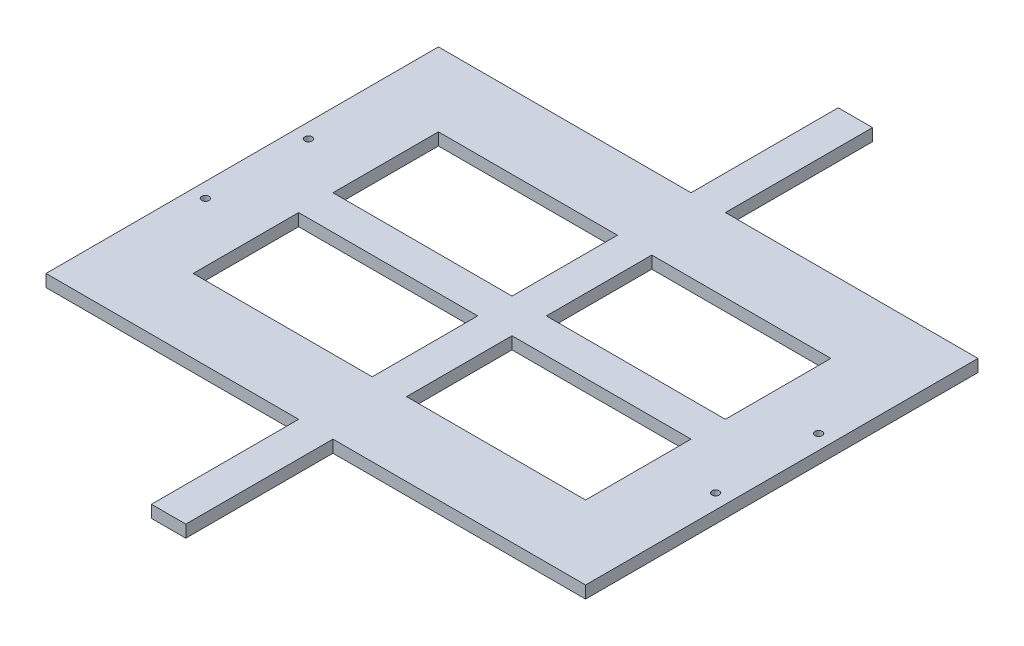
ISO-10303-21;
HEADER;
FILE_DESCRIPTION(('STEP AP214'),'2;1');
FILE_NAME('part.step','',(''),(''),'','','');
FILE_SCHEMA(('AUTOMOTIVE_DESIGN { 1 0 10303 214 1 1 1 1 }'));
ENDSEC;
DATA;
#1=APPLICATION_CONTEXT('core data for automotive mechanical design processes');
#2=APPLICATION_PROTOCOL_DEFINITION('international standard','automotive_design',2000,#1);
#3=PRODUCT_CONTEXT('',#1,'mechanical');
#4=PRODUCT('Part','Part','',(#3));
#5=PRODUCT_RELATED_PRODUCT_CATEGORY('part','',(#4));
#6=PRODUCT_DEFINITION_FORMATION('','',#4);
#7=PRODUCT_DEFINITION_CONTEXT('part definition',#1,'design');
#8=PRODUCT_DEFINITION('design','',#6,#7);
#9=PRODUCT_DEFINITION_SHAPE('','',#8);
#10=(LENGTH_UNIT() NAMED_UNIT(*) SI_UNIT(.MILLI.,.METRE.));
#11=(NAMED_UNIT(*) PLANE_ANGLE_UNIT() SI_UNIT($,.RADIAN.));
#12=(NAMED_UNIT(*) SI_UNIT($,.STERADIAN.) SOLID_ANGLE_UNIT());
#13=UNCERTAINTY_MEASURE_WITH_UNIT(LENGTH_MEASURE(1.E-05),#10,'distance_accuracy_value','');
#14=(GEOMETRIC_REPRESENTATION_CONTEXT(3) GLOBAL_UNCERTAINTY_ASSIGNED_CONTEXT((#13)) GLOBAL_UNIT_ASSIGNED_CONTEXT((#10,
#11,#12)) REPRESENTATION_CONTEXT('',''));
#15=CARTESIAN_POINT('',(0.,0.,0.));
#16=DIRECTION('',(0.,0.,1.));
#17=DIRECTION('',(1.,0.,0.));
#18=AXIS2_PLACEMENT_3D('',#15,#16,#17);
#19=CARTESIAN_POINT('',(0.,5.,130.));
#20=DIRECTION('',(0.,0.,-1.));
#21=DIRECTION('',(-1.,0.,0.));
#22=AXIS2_PLACEMENT_3D('',#19,#20,#21);
#23=PLANE('',#22);
#24=DIRECTION('',(0.,1.,0.));
#25=VECTOR('',#24,1.);
#26=CARTESIAN_POINT('',(87.,0.,130.));
#27=LINE('',#26,#25);
#28=CARTESIAN_POINT('',(87.,0.,130.));
#29=VERTEX_POINT('',#28);
#30=CARTESIAN_POINT('',(87.,5.,130.));
#31=VERTEX_POINT('',#30);
#32=EDGE_CURVE('E225',#29,#31,#27,.T.);
#33=ORIENTED_EDGE('',*,*,#32,.F.);
#34=DIRECTION('',(1.,0.,0.));
#35=VECTOR('',#34,1.);
#36=CARTESIAN_POINT('',(0.,0.,130.));
#37=LINE('',#36,#35);
#38=CARTESIAN_POINT('',(190.,0.,130.));
#39=VERTEX_POINT('',#38);
#40=EDGE_CURVE('E310',#29,#39,#37,.T.);
#41=ORIENTED_EDGE('',*,*,#40,.T.);
#42=DIRECTION('',(0.,-1.,0.));
#43=VECTOR('',#42,1.);
#44=CARTESIAN_POINT('',(190.,5.,130.));
#45=LINE('',#44,#43);
#46=CARTESIAN_POINT('',(190.,5.,130.));
#47=VERTEX_POINT('',#46);
#48=EDGE_CURVE('E249',#47,#39,#45,.T.);
#49=ORIENTED_EDGE('',*,*,#48,.F.);
#50=DIRECTION('',(1.,0.,0.));
#51=VECTOR('',#50,1.);
#52=CARTESIAN_POINT('',(0.,5.,130.));
#53=LINE('',#52,#51);
#54=EDGE_CURVE('E242',#31,#47,#53,.T.);
#55=ORIENTED_EDGE('',*,*,#54,.F.);
#56=EDGE_LOOP('',(#33,#41,#49,#55));
#57=FACE_BOUND('',#56,.T.);
#58=ADVANCED_FACE('F39',(#57),#23,.F.);
#59=CARTESIAN_POINT('',(0.,5.,-30.));
#60=DIRECTION('',(0.,0.,-1.));
#61=DIRECTION('',(-1.,0.,0.));
#62=AXIS2_PLACEMENT_3D('',#59,#60,#61);
#63=PLANE('',#62);
#64=DIRECTION('',(1.,0.,0.));
#65=VECTOR('',#64,1.);
#66=CARTESIAN_POINT('',(0.,0.,-30.));
#67=LINE('',#66,#65);
#68=CARTESIAN_POINT('',(87.,0.,-30.));
#69=VERTEX_POINT('',#68);
#70=CARTESIAN_POINT('',(190.,0.,-30.));
#71=VERTEX_POINT('',#70);
#72=EDGE_CURVE('E307',#69,#71,#67,.T.);
#73=ORIENTED_EDGE('',*,*,#72,.F.);
#74=DIRECTION('',(0.,1.,0.));
#75=VECTOR('',#74,1.);
#76=CARTESIAN_POINT('',(87.,0.,-30.));
#77=LINE('',#76,#75);
#78=CARTESIAN_POINT('',(87.,5.,-30.));
#79=VERTEX_POINT('',#78);
#80=EDGE_CURVE('E471',#69,#79,#77,.T.);
#81=ORIENTED_EDGE('',*,*,#80,.T.);
#82=DIRECTION('',(1.,0.,0.));
#83=VECTOR('',#82,1.);
#84=CARTESIAN_POINT('',(0.,5.,-30.));
#85=LINE('',#84,#83);
#86=CARTESIAN_POINT('',(190.,5.,-30.));
#87=VERTEX_POINT('',#86);
#88=EDGE_CURVE('E416',#79,#87,#85,.T.);
#89=ORIENTED_EDGE('',*,*,#88,.T.);
#90=DIRECTION('',(0.,-1.,0.));
#91=VECTOR('',#90,1.);
#92=CARTESIAN_POINT('',(190.,5.,-30.));
#93=LINE('',#92,#91);
#94=EDGE_CURVE('E318',#87,#71,#93,.T.);
#95=ORIENTED_EDGE('',*,*,#94,.T.);
#96=EDGE_LOOP('',(#73,#81,#89,#95));
#97=FACE_BOUND('',#96,.T.);
#98=ADVANCED_FACE('F448',(#97),#63,.T.);
#99=DIRECTION('',(0.,1.,0.));
#100=VECTOR('',#99,1.);
#101=CARTESIAN_POINT('',(73.,0.,-30.));
#102=LINE('',#101,#100);
#103=CARTESIAN_POINT('',(73.,0.,-30.));
#104=VERTEX_POINT('',#103);
#105=CARTESIAN_POINT('',(73.,5.,-30.));
#106=VERTEX_POINT('',#105);
#107=EDGE_CURVE('E473',#104,#106,#102,.T.);
#108=ORIENTED_EDGE('',*,*,#107,.F.);
#109=CARTESIAN_POINT('',(-30.,0.,-30.));
#110=VERTEX_POINT('',#109);
#111=EDGE_CURVE('E303',#110,#104,#67,.T.);
#112=ORIENTED_EDGE('',*,*,#111,.F.);
#113=DIRECTION('',(0.,-1.,0.));
#114=VECTOR('',#113,1.);
#115=CARTESIAN_POINT('',(-30.,5.,-30.));
#116=LINE('',#115,#114);
#117=CARTESIAN_POINT('',(-30.,5.,-30.));
#118=VERTEX_POINT('',#117);
#119=EDGE_CURVE('E11',#118,#110,#116,.T.);
#120=ORIENTED_EDGE('',*,*,#119,.F.);
#121=EDGE_CURVE('E257',#118,#106,#85,.T.);
#122=ORIENTED_EDGE('',*,*,#121,.T.);
#123=EDGE_LOOP('',(#108,#112,#120,#122));
#124=FACE_BOUND('',#123,.T.);
#125=ADVANCED_FACE('F540',(#124),#63,.T.);
#126=CARTESIAN_POINT('',(-30.,5.,0.));
#127=DIRECTION('',(1.,0.,0.));
#128=DIRECTION('',(0.,0.,-1.));
#129=AXIS2_PLACEMENT_3D('',#126,#127,#128);
#130=PLANE('',#129);
#131=DIRECTION('',(0.,0.,1.));
#132=VECTOR('',#131,1.);
#133=CARTESIAN_POINT('',(-30.,0.,0.));
#134=LINE('',#133,#132);
#135=CARTESIAN_POINT('',(-30.,0.,130.));
#136=VERTEX_POINT('',#135);
#137=EDGE_CURVE('E306',#110,#136,#134,.T.);
#138=ORIENTED_EDGE('',*,*,#137,.T.);
#139=DIRECTION('',(0.,-1.,0.));
#140=VECTOR('',#139,1.);
#141=CARTESIAN_POINT('',(-30.,5.,130.));
#142=LINE('',#141,#140);
#143=CARTESIAN_POINT('',(-30.,5.,130.));
#144=VERTEX_POINT('',#143);
#145=EDGE_CURVE('E48',#144,#136,#142,.T.);
#146=ORIENTED_EDGE('',*,*,#145,.F.);
#147=DIRECTION('',(0.,0.,1.));
#148=VECTOR('',#147,1.);
#149=CARTESIAN_POINT('',(-30.,5.,0.));
#150=LINE('',#149,#148);
#151=EDGE_CURVE('E252',#118,#144,#150,.T.);
#152=ORIENTED_EDGE('',*,*,#151,.F.);
#153=ORIENTED_EDGE('',*,*,#119,.T.);
#154=EDGE_LOOP('',(#138,#146,#152,#153));
#155=FACE_BOUND('',#154,.T.);
#156=ADVANCED_FACE('F545',(#155),#130,.F.);
#157=CARTESIAN_POINT('',(73.,0.,130.));
#158=VERTEX_POINT('',#157);
#159=EDGE_CURVE('E311',#136,#158,#37,.T.);
#160=ORIENTED_EDGE('',*,*,#159,.T.);
#161=DIRECTION('',(0.,1.,0.));
#162=VECTOR('',#161,1.);
#163=CARTESIAN_POINT('',(73.,0.,130.));
#164=LINE('',#163,#162);
#165=CARTESIAN_POINT('',(73.,5.,130.));
#166=VERTEX_POINT('',#165);
#167=EDGE_CURVE('E236',#158,#166,#164,.T.);
#168=ORIENTED_EDGE('',*,*,#167,.T.);
#169=EDGE_CURVE('E251',#144,#166,#53,.T.);
#170=ORIENTED_EDGE('',*,*,#169,.F.);
#171=ORIENTED_EDGE('',*,*,#145,.T.);
#172=EDGE_LOOP('',(#160,#168,#170,#171));
#173=FACE_BOUND('',#172,.T.);
#174=ADVANCED_FACE('F536',(#173),#23,.F.);
#175=CARTESIAN_POINT('',(0.,5.,57.));
#176=DIRECTION('',(0.,0.,-1.));
#177=DIRECTION('',(-1.,0.,0.));
#178=AXIS2_PLACEMENT_3D('',#175,#176,#177);
#179=PLANE('',#178);
#180=DIRECTION('',(1.,0.,0.));
#181=VECTOR('',#180,1.);
#182=CARTESIAN_POINT('',(0.,0.,57.));
#183=LINE('',#182,#181);
#184=CARTESIAN_POINT('',(0.,0.,57.));
#185=VERTEX_POINT('',#184);
#186=CARTESIAN_POINT('',(73.,0.,57.));
#187=VERTEX_POINT('',#186);
#188=EDGE_CURVE('E297',#185,#187,#183,.T.);
#189=ORIENTED_EDGE('',*,*,#188,.T.);
#190=DIRECTION('',(0.,-1.,0.));
#191=VECTOR('',#190,1.);
#192=CARTESIAN_POINT('',(73.,5.,57.));
#193=LINE('',#192,#191);
#194=CARTESIAN_POINT('',(73.,5.,57.));
#195=VERTEX_POINT('',#194);
#196=EDGE_CURVE('E321',#195,#187,#193,.T.);
#197=ORIENTED_EDGE('',*,*,#196,.F.);
#198=DIRECTION('',(1.,0.,0.));
#199=VECTOR('',#198,1.);
#200=CARTESIAN_POINT('',(0.,5.,57.));
#201=LINE('',#200,#199);
#202=CARTESIAN_POINT('',(0.,5.,57.));
#203=VERTEX_POINT('',#202);
#204=EDGE_CURVE('E411',#203,#195,#201,.T.);
#205=ORIENTED_EDGE('',*,*,#204,.F.);
#206=DIRECTION('',(0.,-1.,0.));
#207=VECTOR('',#206,1.);
#208=CARTESIAN_POINT('',(0.,5.,57.));
#209=LINE('',#208,#207);
#210=EDGE_CURVE('E325',#203,#185,#209,.T.);
#211=ORIENTED_EDGE('',*,*,#210,.T.);
#212=EDGE_LOOP('',(#189,#197,#205,#211));
#213=FACE_BOUND('',#212,.T.);
#214=ADVANCED_FACE('F544',(#213),#179,.F.);
#215=CARTESIAN_POINT('',(73.,5.,0.));
#216=DIRECTION('',(1.,0.,0.));
#217=DIRECTION('',(0.,0.,-1.));
#218=AXIS2_PLACEMENT_3D('',#215,#216,#217);
#219=PLANE('',#218);
#220=DIRECTION('',(0.,0.,1.));
#221=VECTOR('',#220,1.);
#222=CARTESIAN_POINT('',(73.,0.,0.));
#223=LINE('',#222,#221);
#224=CARTESIAN_POINT('',(73.,0.,100.));
#225=VERTEX_POINT('',#224);
#226=EDGE_CURVE('E300',#187,#225,#223,.T.);
#227=ORIENTED_EDGE('',*,*,#226,.T.);
#228=DIRECTION('',(0.,-1.,0.));
#229=VECTOR('',#228,1.);
#230=CARTESIAN_POINT('',(73.,5.,100.));
#231=LINE('',#230,#229);
#232=CARTESIAN_POINT('',(73.,5.,100.));
#233=VERTEX_POINT('',#232);
#234=EDGE_CURVE('E330',#233,#225,#231,.T.);
#235=ORIENTED_EDGE('',*,*,#234,.F.);
#236=DIRECTION('',(0.,0.,1.));
#237=VECTOR('',#236,1.);
#238=CARTESIAN_POINT('',(73.,5.,0.));
#239=LINE('',#238,#237);
#240=EDGE_CURVE('E414',#195,#233,#239,.T.);
#241=ORIENTED_EDGE('',*,*,#240,.F.);
#242=ORIENTED_EDGE('',*,*,#196,.T.);
#243=EDGE_LOOP('',(#227,#235,#241,#242));
#244=FACE_BOUND('',#243,.T.);
#245=ADVANCED_FACE('F435',(#244),#219,.F.);
#246=CARTESIAN_POINT('',(0.,5.,100.));
#247=DIRECTION('',(0.,0.,-1.));
#248=DIRECTION('',(-1.,0.,0.));
#249=AXIS2_PLACEMENT_3D('',#246,#247,#248);
#250=PLANE('',#249);
#251=DIRECTION('',(1.,0.,0.));
#252=VECTOR('',#251,1.);
#253=CARTESIAN_POINT('',(0.,0.,100.));
#254=LINE('',#253,#252);
#255=CARTESIAN_POINT('',(0.,0.,100.));
#256=VERTEX_POINT('',#255);
#257=EDGE_CURVE('E287',#256,#225,#254,.T.);
#258=ORIENTED_EDGE('',*,*,#257,.F.);
#259=DIRECTION('',(0.,-1.,0.));
#260=VECTOR('',#259,1.);
#261=CARTESIAN_POINT('',(0.,5.,100.));
#262=LINE('',#261,#260);
#263=CARTESIAN_POINT('',(0.,5.,100.));
#264=VERTEX_POINT('',#263);
#265=EDGE_CURVE('E327',#264,#256,#262,.T.);
#266=ORIENTED_EDGE('',*,*,#265,.F.);
#267=DIRECTION('',(1.,0.,0.));
#268=VECTOR('',#267,1.);
#269=CARTESIAN_POINT('',(0.,5.,100.));
#270=LINE('',#269,#268);
#271=EDGE_CURVE('E397',#264,#233,#270,.T.);
#272=ORIENTED_EDGE('',*,*,#271,.T.);
#273=ORIENTED_EDGE('',*,*,#234,.T.);
#274=EDGE_LOOP('',(#258,#266,#272,#273));
#275=FACE_BOUND('',#274,.T.);
#276=ADVANCED_FACE('F429',(#275),#250,.T.);
#277=CARTESIAN_POINT('',(73.,5.,0.));
#278=DIRECTION('',(1.,0.,0.));
#279=DIRECTION('',(0.,0.,-1.));
#280=AXIS2_PLACEMENT_3D('',#277,#278,#279);
#281=PLANE('',#280);
#282=DIRECTION('',(0.,0.,1.));
#283=VECTOR('',#282,1.);
#284=CARTESIAN_POINT('',(73.,0.,0.));
#285=LINE('',#284,#283);
#286=CARTESIAN_POINT('',(73.,0.,0.));
#287=VERTEX_POINT('',#286);
#288=CARTESIAN_POINT('',(73.,0.,43.));
#289=VERTEX_POINT('',#288);
#290=EDGE_CURVE('E286',#287,#289,#285,.T.);
#291=ORIENTED_EDGE('',*,*,#290,.T.);
#292=DIRECTION('',(0.,-1.,0.));
#293=VECTOR('',#292,1.);
#294=CARTESIAN_POINT('',(73.,5.,43.));
#295=LINE('',#294,#293);
#296=CARTESIAN_POINT('',(73.,5.,43.));
#297=VERTEX_POINT('',#296);
#298=EDGE_CURVE('E328',#297,#289,#295,.T.);
#299=ORIENTED_EDGE('',*,*,#298,.F.);
#300=DIRECTION('',(0.,0.,1.));
#301=VECTOR('',#300,1.);
#302=CARTESIAN_POINT('',(73.,5.,0.));
#303=LINE('',#302,#301);
#304=CARTESIAN_POINT('',(73.,5.,0.));
#305=VERTEX_POINT('',#304);
#306=EDGE_CURVE('E395',#305,#297,#303,.T.);
#307=ORIENTED_EDGE('',*,*,#306,.F.);
#308=DIRECTION('',(0.,-1.,0.));
#309=VECTOR('',#308,1.);
#310=CARTESIAN_POINT('',(73.,5.,0.));
#311=LINE('',#310,#309);
#312=EDGE_CURVE('E334',#305,#287,#311,.T.);
#313=ORIENTED_EDGE('',*,*,#312,.T.);
#314=EDGE_LOOP('',(#291,#299,#307,#313));
#315=FACE_BOUND('',#314,.T.);
#316=ADVANCED_FACE('F510',(#315),#281,.F.);
#317=CARTESIAN_POINT('',(0.,5.,43.));
#318=DIRECTION('',(0.,0.,-1.));
#319=DIRECTION('',(-1.,0.,0.));
#320=AXIS2_PLACEMENT_3D('',#317,#318,#319);
#321=PLANE('',#320);
#322=DIRECTION('',(1.,0.,0.));
#323=VECTOR('',#322,1.);
#324=CARTESIAN_POINT('',(0.,0.,43.));
#325=LINE('',#324,#323);
#326=CARTESIAN_POINT('',(0.,0.,43.));
#327=VERTEX_POINT('',#326);
#328=EDGE_CURVE('E290',#327,#289,#325,.T.);
#329=ORIENTED_EDGE('',*,*,#328,.F.);
#330=DIRECTION('',(0.,-1.,0.));
#331=VECTOR('',#330,1.);
#332=CARTESIAN_POINT('',(0.,5.,43.));
#333=LINE('',#332,#331);
#334=CARTESIAN_POINT('',(0.,5.,43.));
#335=VERTEX_POINT('',#334);
#336=EDGE_CURVE('E340',#335,#327,#333,.T.);
#337=ORIENTED_EDGE('',*,*,#336,.F.);
#338=DIRECTION('',(1.,0.,0.));
#339=VECTOR('',#338,1.);
#340=CARTESIAN_POINT('',(0.,5.,43.));
#341=LINE('',#340,#339);
#342=EDGE_CURVE('E404',#335,#297,#341,.T.);
#343=ORIENTED_EDGE('',*,*,#342,.T.);
#344=ORIENTED_EDGE('',*,*,#298,.T.);
#345=EDGE_LOOP('',(#329,#337,#343,#344));
#346=FACE_BOUND('',#345,.T.);
#347=ADVANCED_FACE('F514',(#346),#321,.T.);
#348=CARTESIAN_POINT('',(0.,5.,0.));
#349=DIRECTION('',(1.,0.,0.));
#350=DIRECTION('',(0.,0.,-1.));
#351=AXIS2_PLACEMENT_3D('',#348,#349,#350);
#352=PLANE('',#351);
#353=DIRECTION('',(0.,0.,1.));
#354=VECTOR('',#353,1.);
#355=CARTESIAN_POINT('',(0.,0.,0.));
#356=LINE('',#355,#354);
#357=CARTESIAN_POINT('',(0.,0.,0.));
#358=VERTEX_POINT('',#357);
#359=EDGE_CURVE('E293',#358,#327,#356,.T.);
#360=ORIENTED_EDGE('',*,*,#359,.F.);
#361=DIRECTION('',(0.,-1.,0.));
#362=VECTOR('',#361,1.);
#363=CARTESIAN_POINT('',(0.,5.,0.));
#364=LINE('',#363,#362);
#365=CARTESIAN_POINT('',(0.,5.,0.));
#366=VERTEX_POINT('',#365);
#367=EDGE_CURVE('E337',#366,#358,#364,.T.);
#368=ORIENTED_EDGE('',*,*,#367,.F.);
#369=DIRECTION('',(0.,0.,1.));
#370=VECTOR('',#369,1.);
#371=CARTESIAN_POINT('',(0.,5.,0.));
#372=LINE('',#371,#370);
#373=EDGE_CURVE('E407',#366,#335,#372,.T.);
#374=ORIENTED_EDGE('',*,*,#373,.T.);
#375=ORIENTED_EDGE('',*,*,#336,.T.);
#376=EDGE_LOOP('',(#360,#368,#374,#375));
#377=FACE_BOUND('',#376,.T.);
#378=ADVANCED_FACE('F517',(#377),#352,.T.);
#379=CARTESIAN_POINT('',(87.,5.,0.));
#380=DIRECTION('',(1.,0.,0.));
#381=DIRECTION('',(0.,0.,-1.));
#382=AXIS2_PLACEMENT_3D('',#379,#380,#381);
#383=PLANE('',#382);
#384=DIRECTION('',(0.,0.,1.));
#385=VECTOR('',#384,1.);
#386=CARTESIAN_POINT('',(87.,0.,0.));
#387=LINE('',#386,#385);
#388=CARTESIAN_POINT('',(87.,0.,57.));
#389=VERTEX_POINT('',#388);
#390=CARTESIAN_POINT('',(87.,0.,100.));
#391=VERTEX_POINT('',#390);
#392=EDGE_CURVE('E276',#389,#391,#387,.T.);
#393=ORIENTED_EDGE('',*,*,#392,.F.);
#394=DIRECTION('',(0.,-1.,0.));
#395=VECTOR('',#394,1.);
#396=CARTESIAN_POINT('',(87.,5.,57.));
#397=LINE('',#396,#395);
#398=CARTESIAN_POINT('',(87.,5.,57.));
#399=VERTEX_POINT('',#398);
#400=EDGE_CURVE('E338',#399,#389,#397,.T.);
#401=ORIENTED_EDGE('',*,*,#400,.F.);
#402=DIRECTION('',(0.,0.,1.));
#403=VECTOR('',#402,1.);
#404=CARTESIAN_POINT('',(87.,5.,0.));
#405=LINE('',#404,#403);
#406=CARTESIAN_POINT('',(87.,5.,100.));
#407=VERTEX_POINT('',#406);
#408=EDGE_CURVE('E380',#399,#407,#405,.T.);
#409=ORIENTED_EDGE('',*,*,#408,.T.);
#410=DIRECTION('',(0.,-1.,0.));
#411=VECTOR('',#410,1.);
#412=CARTESIAN_POINT('',(87.,5.,100.));
#413=LINE('',#412,#411);
#414=EDGE_CURVE('E343',#407,#391,#413,.T.);
#415=ORIENTED_EDGE('',*,*,#414,.T.);
#416=EDGE_LOOP('',(#393,#401,#409,#415));
#417=FACE_BOUND('',#416,.T.);
#418=ADVANCED_FACE('F800',(#417),#383,.T.);
#419=CARTESIAN_POINT('',(0.,5.,57.));
#420=DIRECTION('',(0.,0.,-1.));
#421=DIRECTION('',(-1.,0.,0.));
#422=AXIS2_PLACEMENT_3D('',#419,#420,#421);
#423=PLANE('',#422);
#424=DIRECTION('',(1.,0.,0.));
#425=VECTOR('',#424,1.);
#426=CARTESIAN_POINT('',(0.,0.,57.));
#427=LINE('',#426,#425);
#428=CARTESIAN_POINT('',(160.,0.,57.));
#429=VERTEX_POINT('',#428);
#430=EDGE_CURVE('E280',#389,#429,#427,.T.);
#431=ORIENTED_EDGE('',*,*,#430,.T.);
#432=DIRECTION('',(0.,-1.,0.));
#433=VECTOR('',#432,1.);
#434=CARTESIAN_POINT('',(160.,5.,57.));
#435=LINE('',#434,#433);
#436=CARTESIAN_POINT('',(160.,5.,57.));
#437=VERTEX_POINT('',#436);
#438=EDGE_CURVE('E347',#437,#429,#435,.T.);
#439=ORIENTED_EDGE('',*,*,#438,.F.);
#440=DIRECTION('',(1.,0.,0.));
#441=VECTOR('',#440,1.);
#442=CARTESIAN_POINT('',(0.,5.,57.));
#443=LINE('',#442,#441);
#444=EDGE_CURVE('E385',#399,#437,#443,.T.);
#445=ORIENTED_EDGE('',*,*,#444,.F.);
#446=ORIENTED_EDGE('',*,*,#400,.T.);
#447=EDGE_LOOP('',(#431,#439,#445,#446));
#448=FACE_BOUND('',#447,.T.);
#449=ADVANCED_FACE('F792',(#448),#423,.F.);
#450=CARTESIAN_POINT('',(160.,5.,0.));
#451=DIRECTION('',(1.,0.,0.));
#452=DIRECTION('',(0.,0.,-1.));
#453=AXIS2_PLACEMENT_3D('',#450,#451,#452);
#454=PLANE('',#453);
#455=DIRECTION('',(0.,0.,1.));
#456=VECTOR('',#455,1.);
#457=CARTESIAN_POINT('',(160.,0.,0.));
#458=LINE('',#457,#456);
#459=CARTESIAN_POINT('',(160.,0.,100.));
#460=VERTEX_POINT('',#459);
#461=EDGE_CURVE('E277',#429,#460,#458,.T.);
#462=ORIENTED_EDGE('',*,*,#461,.T.);
#463=DIRECTION('',(0.,-1.,0.));
#464=VECTOR('',#463,1.);
#465=CARTESIAN_POINT('',(160.,5.,100.));
#466=LINE('',#465,#464);
#467=CARTESIAN_POINT('',(160.,5.,100.));
#468=VERTEX_POINT('',#467);
#469=EDGE_CURVE('E345',#468,#460,#466,.T.);
#470=ORIENTED_EDGE('',*,*,#469,.F.);
#471=DIRECTION('',(0.,0.,1.));
#472=VECTOR('',#471,1.);
#473=CARTESIAN_POINT('',(160.,5.,0.));
#474=LINE('',#473,#472);
#475=EDGE_CURVE('E383',#437,#468,#474,.T.);
#476=ORIENTED_EDGE('',*,*,#475,.F.);
#477=ORIENTED_EDGE('',*,*,#438,.T.);
#478=EDGE_LOOP('',(#462,#470,#476,#477));
#479=FACE_BOUND('',#478,.T.);
#480=ADVANCED_FACE('F737',(#479),#454,.F.);
#481=CARTESIAN_POINT('',(0.,5.,43.));
#482=DIRECTION('',(0.,0.,-1.));
#483=DIRECTION('',(-1.,0.,0.));
#484=AXIS2_PLACEMENT_3D('',#481,#482,#483);
#485=PLANE('',#484);
#486=DIRECTION('',(1.,0.,0.));
#487=VECTOR('',#486,1.);
#488=CARTESIAN_POINT('',(0.,0.,43.));
#489=LINE('',#488,#487);
#490=CARTESIAN_POINT('',(87.,0.,43.));
#491=VERTEX_POINT('',#490);
#492=CARTESIAN_POINT('',(160.,0.,43.));
#493=VERTEX_POINT('',#492);
#494=EDGE_CURVE('E263',#491,#493,#489,.T.);
#495=ORIENTED_EDGE('',*,*,#494,.F.);
#496=DIRECTION('',(0.,-1.,0.));
#497=VECTOR('',#496,1.);
#498=CARTESIAN_POINT('',(87.,5.,43.));
#499=LINE('',#498,#497);
#500=CARTESIAN_POINT('',(87.,5.,43.));
#501=VERTEX_POINT('',#500);
#502=EDGE_CURVE('E43',#501,#491,#499,.T.);
#503=ORIENTED_EDGE('',*,*,#502,.F.);
#504=DIRECTION('',(1.,0.,0.));
#505=VECTOR('',#504,1.);
#506=CARTESIAN_POINT('',(0.,5.,43.));
#507=LINE('',#506,#505);
#508=CARTESIAN_POINT('',(160.,5.,43.));
#509=VERTEX_POINT('',#508);
#510=EDGE_CURVE('E317',#501,#509,#507,.T.);
#511=ORIENTED_EDGE('',*,*,#510,.T.);
#512=DIRECTION('',(0.,-1.,0.));
#513=VECTOR('',#512,1.);
#514=CARTESIAN_POINT('',(160.,5.,43.));
#515=LINE('',#514,#513);
#516=EDGE_CURVE('E262',#509,#493,#515,.T.);
#517=ORIENTED_EDGE('',*,*,#516,.T.);
#518=EDGE_LOOP('',(#495,#503,#511,#517));
#519=FACE_BOUND('',#518,.T.);
#520=ADVANCED_FACE('F41',(#519),#485,.T.);
#521=CARTESIAN_POINT('',(87.,5.,0.));
#522=DIRECTION('',(1.,0.,0.));
#523=DIRECTION('',(0.,0.,-1.));
#524=AXIS2_PLACEMENT_3D('',#521,#522,#523);
#525=PLANE('',#524);
#526=DIRECTION('',(0.,0.,1.));
#527=VECTOR('',#526,1.);
#528=CARTESIAN_POINT('',(87.,0.,0.));
#529=LINE('',#528,#527);
#530=CARTESIAN_POINT('',(87.,0.,0.));
#531=VERTEX_POINT('',#530);
#532=EDGE_CURVE('E266',#531,#491,#529,.T.);
#533=ORIENTED_EDGE('',*,*,#532,.F.);
#534=DIRECTION('',(0.,-1.,0.));
#535=VECTOR('',#534,1.);
#536=CARTESIAN_POINT('',(87.,5.,0.));
#537=LINE('',#536,#535);
#538=CARTESIAN_POINT('',(87.,5.,0.));
#539=VERTEX_POINT('',#538);
#540=EDGE_CURVE('E354',#539,#531,#537,.T.);
#541=ORIENTED_EDGE('',*,*,#540,.F.);
#542=DIRECTION('',(0.,0.,1.));
#543=VECTOR('',#542,1.);
#544=CARTESIAN_POINT('',(87.,5.,0.));
#545=LINE('',#544,#543);
#546=EDGE_CURVE('E364',#539,#501,#545,.T.);
#547=ORIENTED_EDGE('',*,*,#546,.T.);
#548=ORIENTED_EDGE('',*,*,#502,.T.);
#549=EDGE_LOOP('',(#533,#541,#547,#548));
#550=FACE_BOUND('',#549,.T.);
#551=ADVANCED_FACE('F362',(#550),#525,.T.);
#552=CARTESIAN_POINT('',(0.,5.,0.));
#553=DIRECTION('',(0.,0.,-1.));
#554=DIRECTION('',(-1.,0.,0.));
#555=AXIS2_PLACEMENT_3D('',#552,#553,#554);
#556=PLANE('',#555);
#557=DIRECTION('',(1.,0.,0.));
#558=VECTOR('',#557,1.);
#559=CARTESIAN_POINT('',(0.,0.,0.));
#560=LINE('',#559,#558);
#561=CARTESIAN_POINT('',(160.,0.,0.));
#562=VERTEX_POINT('',#561);
#563=EDGE_CURVE('E270',#531,#562,#560,.T.);
#564=ORIENTED_EDGE('',*,*,#563,.T.);
#565=DIRECTION('',(0.,-1.,0.));
#566=VECTOR('',#565,1.);
#567=CARTESIAN_POINT('',(160.,5.,0.));
#568=LINE('',#567,#566);
#569=CARTESIAN_POINT('',(160.,5.,0.));
#570=VERTEX_POINT('',#569);
#571=EDGE_CURVE('E352',#570,#562,#568,.T.);
#572=ORIENTED_EDGE('',*,*,#571,.F.);
#573=DIRECTION('',(1.,0.,0.));
#574=VECTOR('',#573,1.);
#575=CARTESIAN_POINT('',(0.,5.,0.));
#576=LINE('',#575,#574);
#577=EDGE_CURVE('E381',#539,#570,#576,.T.);
#578=ORIENTED_EDGE('',*,*,#577,.F.);
#579=ORIENTED_EDGE('',*,*,#540,.T.);
#580=EDGE_LOOP('',(#564,#572,#578,#579));
#581=FACE_BOUND('',#580,.T.);
#582=ADVANCED_FACE('F374',(#581),#556,.F.);
#583=EDGE_CURVE('E296',#185,#256,#356,.T.);
#584=ORIENTED_EDGE('',*,*,#583,.F.);
#585=ORIENTED_EDGE('',*,*,#210,.F.);
#586=EDGE_CURVE('E410',#203,#264,#372,.T.);
#587=ORIENTED_EDGE('',*,*,#586,.T.);
#588=ORIENTED_EDGE('',*,*,#265,.T.);
#589=EDGE_LOOP('',(#584,#585,#587,#588));
#590=FACE_BOUND('',#589,.T.);
#591=ADVANCED_FACE('F754',(#590),#352,.T.);
#592=EDGE_CURVE('E273',#358,#287,#560,.T.);
#593=ORIENTED_EDGE('',*,*,#592,.T.);
#594=ORIENTED_EDGE('',*,*,#312,.F.);
#595=EDGE_CURVE('E388',#366,#305,#576,.T.);
#596=ORIENTED_EDGE('',*,*,#595,.F.);
#597=ORIENTED_EDGE('',*,*,#367,.T.);
#598=EDGE_LOOP('',(#593,#594,#596,#597));
#599=FACE_BOUND('',#598,.T.);
#600=ADVANCED_FACE('F520',(#599),#556,.F.);
#601=EDGE_CURVE('E283',#391,#460,#254,.T.);
#602=ORIENTED_EDGE('',*,*,#601,.F.);
#603=ORIENTED_EDGE('',*,*,#414,.F.);
#604=EDGE_CURVE('E389',#407,#468,#270,.T.);
#605=ORIENTED_EDGE('',*,*,#604,.T.);
#606=ORIENTED_EDGE('',*,*,#469,.T.);
#607=EDGE_LOOP('',(#602,#603,#605,#606));
#608=FACE_BOUND('',#607,.T.);
#609=ADVANCED_FACE('F735',(#608),#250,.T.);
#610=EDGE_CURVE('E272',#562,#493,#458,.T.);
#611=ORIENTED_EDGE('',*,*,#610,.T.);
#612=ORIENTED_EDGE('',*,*,#516,.F.);
#613=EDGE_CURVE('E378',#570,#509,#474,.T.);
#614=ORIENTED_EDGE('',*,*,#613,.F.);
#615=ORIENTED_EDGE('',*,*,#571,.T.);
#616=EDGE_LOOP('',(#611,#612,#614,#615));
#617=FACE_BOUND('',#616,.T.);
#618=ADVANCED_FACE('F377',(#617),#454,.F.);
#619=CARTESIAN_POINT('',(190.,5.,0.));
#620=DIRECTION('',(1.,0.,0.));
#621=DIRECTION('',(0.,0.,-1.));
#622=AXIS2_PLACEMENT_3D('',#619,#620,#621);
#623=PLANE('',#622);
#624=DIRECTION('',(0.,0.,1.));
#625=VECTOR('',#624,1.);
#626=CARTESIAN_POINT('',(190.,0.,0.));
#627=LINE('',#626,#625);
#628=EDGE_CURVE('E314',#71,#39,#627,.T.);
#629=ORIENTED_EDGE('',*,*,#628,.F.);
#630=ORIENTED_EDGE('',*,*,#94,.F.);
#631=DIRECTION('',(0.,0.,1.));
#632=VECTOR('',#631,1.);
#633=CARTESIAN_POINT('',(190.,5.,0.));
#634=LINE('',#633,#632);
#635=EDGE_CURVE('E255',#87,#47,#634,.T.);
#636=ORIENTED_EDGE('',*,*,#635,.T.);
#637=ORIENTED_EDGE('',*,*,#48,.T.);
#638=EDGE_LOOP('',(#629,#630,#636,#637));
#639=FACE_BOUND('',#638,.T.);
#640=ADVANCED_FACE('F450',(#639),#623,.T.);
#641=CARTESIAN_POINT('',(0.,5.,0.));
#642=DIRECTION('',(0.,1.,0.));
#643=DIRECTION('',(0.,0.,1.));
#644=AXIS2_PLACEMENT_3D('',#641,#642,#643);
#645=PLANE('',#644);
#646=CARTESIAN_POINT('',(-24.,5.,71.));
#647=DIRECTION('',(0.,1.,0.));
#648=DIRECTION('',(0.,0.,-1.));
#649=AXIS2_PLACEMENT_3D('',#646,#647,#648);
#650=CIRCLE('',#649,1.5);
#651=CARTESIAN_POINT('',(-24.,5.,69.5));
#652=VERTEX_POINT('',#651);
#653=EDGE_CURVE('E482',#652,#652,#650,.T.);
#654=ORIENTED_EDGE('',*,*,#653,.F.);
#655=EDGE_LOOP('',(#654));
#656=FACE_BOUND('',#655,.T.);
#657=CARTESIAN_POINT('',(184.,5.,29.));
#658=DIRECTION('',(0.,1.,0.));
#659=DIRECTION('',(0.,0.,-1.));
#660=AXIS2_PLACEMENT_3D('',#657,#658,#659);
#661=CIRCLE('',#660,1.50000000000002);
#662=CARTESIAN_POINT('',(184.,5.,27.4999999999999));
#663=VERTEX_POINT('',#662);
#664=EDGE_CURVE('E489',#663,#663,#661,.T.);
#665=ORIENTED_EDGE('',*,*,#664,.F.);
#666=EDGE_LOOP('',(#665));
#667=FACE_BOUND('',#666,.T.);
#668=CARTESIAN_POINT('',(184.,5.,71.));
#669=DIRECTION('',(0.,1.,0.));
#670=DIRECTION('',(0.,0.,1.));
#671=AXIS2_PLACEMENT_3D('',#668,#669,#670);
#672=CIRCLE('',#671,1.50000000000002);
#673=CARTESIAN_POINT('',(184.,5.,72.5));
#674=VERTEX_POINT('',#673);
#675=EDGE_CURVE('E476',#674,#674,#672,.T.);
#676=ORIENTED_EDGE('',*,*,#675,.F.);
#677=EDGE_LOOP('',(#676));
#678=FACE_BOUND('',#677,.T.);
#679=CARTESIAN_POINT('',(-24.,5.,29.));
#680=DIRECTION('',(0.,1.,0.));
#681=DIRECTION('',(0.,0.,1.));
#682=AXIS2_PLACEMENT_3D('',#679,#680,#681);
#683=CIRCLE('',#682,1.5);
#684=CARTESIAN_POINT('',(-24.,5.,30.5));
#685=VERTEX_POINT('',#684);
#686=EDGE_CURVE('E485',#685,#685,#683,.T.);
#687=ORIENTED_EDGE('',*,*,#686,.F.);
#688=EDGE_LOOP('',(#687));
#689=FACE_BOUND('',#688,.T.);
#690=ORIENTED_EDGE('',*,*,#510,.F.);
#691=ORIENTED_EDGE('',*,*,#546,.F.);
#692=ORIENTED_EDGE('',*,*,#577,.T.);
#693=ORIENTED_EDGE('',*,*,#613,.T.);
#694=EDGE_LOOP('',(#690,#691,#692,#693));
#695=FACE_BOUND('',#694,.T.);
#696=ORIENTED_EDGE('',*,*,#408,.F.);
#697=ORIENTED_EDGE('',*,*,#444,.T.);
#698=ORIENTED_EDGE('',*,*,#475,.T.);
#699=ORIENTED_EDGE('',*,*,#604,.F.);
#700=EDGE_LOOP('',(#696,#697,#698,#699));
#701=FACE_BOUND('',#700,.T.);
#702=ORIENTED_EDGE('',*,*,#306,.T.);
#703=ORIENTED_EDGE('',*,*,#342,.F.);
#704=ORIENTED_EDGE('',*,*,#373,.F.);
#705=ORIENTED_EDGE('',*,*,#595,.T.);
#706=EDGE_LOOP('',(#702,#703,#704,#705));
#707=FACE_BOUND('',#706,.T.);
#708=ORIENTED_EDGE('',*,*,#204,.T.);
#709=ORIENTED_EDGE('',*,*,#240,.T.);
#710=ORIENTED_EDGE('',*,*,#271,.F.);
#711=ORIENTED_EDGE('',*,*,#586,.F.);
#712=EDGE_LOOP('',(#708,#709,#710,#711));
#713=FACE_BOUND('',#712,.T.);
#714=ORIENTED_EDGE('',*,*,#121,.F.);
#715=ORIENTED_EDGE('',*,*,#151,.T.);
#716=ORIENTED_EDGE('',*,*,#169,.T.);
#717=DIRECTION('',(0.,0.,1.));
#718=VECTOR('',#717,1.);
#719=CARTESIAN_POINT('',(73.,5.,190.));
#720=LINE('',#719,#718);
#721=CARTESIAN_POINT('',(73.,5.,190.));
#722=VERTEX_POINT('',#721);
#723=EDGE_CURVE('E56',#166,#722,#720,.T.);
#724=ORIENTED_EDGE('',*,*,#723,.T.);
#725=DIRECTION('',(1.,0.,0.));
#726=VECTOR('',#725,1.);
#727=CARTESIAN_POINT('',(73.,5.,190.));
#728=LINE('',#727,#726);
#729=CARTESIAN_POINT('',(87.0000000000001,5.,190.));
#730=VERTEX_POINT('',#729);
#731=EDGE_CURVE('E245',#722,#730,#728,.T.);
#732=ORIENTED_EDGE('',*,*,#731,.T.);
#733=DIRECTION('',(0.,0.,-1.));
#734=VECTOR('',#733,1.);
#735=CARTESIAN_POINT('',(87.0000000000001,5.,190.));
#736=LINE('',#735,#734);
#737=EDGE_CURVE('E228',#730,#31,#736,.T.);
#738=ORIENTED_EDGE('',*,*,#737,.T.);
#739=ORIENTED_EDGE('',*,*,#54,.T.);
#740=ORIENTED_EDGE('',*,*,#635,.F.);
#741=ORIENTED_EDGE('',*,*,#88,.F.);
#742=DIRECTION('',(0.,0.,-1.));
#743=VECTOR('',#742,1.);
#744=CARTESIAN_POINT('',(87.,5.,-90.));
#745=LINE('',#744,#743);
#746=CARTESIAN_POINT('',(87.,5.,-90.));
#747=VERTEX_POINT('',#746);
#748=EDGE_CURVE('E64',#79,#747,#745,.T.);
#749=ORIENTED_EDGE('',*,*,#748,.T.);
#750=DIRECTION('',(-1.,0.,0.));
#751=VECTOR('',#750,1.);
#752=CARTESIAN_POINT('',(73.,5.,-90.));
#753=LINE('',#752,#751);
#754=CARTESIAN_POINT('',(73.,5.,-90.));
#755=VERTEX_POINT('',#754);
#756=EDGE_CURVE('E454',#747,#755,#753,.T.);
#757=ORIENTED_EDGE('',*,*,#756,.T.);
#758=DIRECTION('',(0.,0.,1.));
#759=VECTOR('',#758,1.);
#760=CARTESIAN_POINT('',(73.,5.,-90.));
#761=LINE('',#760,#759);
#762=EDGE_CURVE('E455',#755,#106,#761,.T.);
#763=ORIENTED_EDGE('',*,*,#762,.T.);
#764=EDGE_LOOP('',(#714,#715,#716,#724,#732,#738,#739,#740,#741,#749,#757,#763));
#765=FACE_BOUND('',#764,.T.);
#766=ADVANCED_FACE('F240',(#656,#667,#678,#689,#695,#701,#707,#713,#765),#645,.T.);
#767=CARTESIAN_POINT('',(0.,0.,0.));
#768=DIRECTION('',(0.,1.,0.));
#769=DIRECTION('',(0.,0.,1.));
#770=AXIS2_PLACEMENT_3D('',#767,#768,#769);
#771=PLANE('',#770);
#772=CARTESIAN_POINT('',(-24.,0.,71.));
#773=DIRECTION('',(0.,1.,0.));
#774=DIRECTION('',(0.,0.,-1.));
#775=AXIS2_PLACEMENT_3D('',#772,#773,#774);
#776=CIRCLE('',#775,1.5);
#777=CARTESIAN_POINT('',(-24.,0.,69.5));
#778=VERTEX_POINT('',#777);
#779=EDGE_CURVE('E486',#778,#778,#776,.T.);
#780=ORIENTED_EDGE('',*,*,#779,.T.);
#781=EDGE_LOOP('',(#780));
#782=FACE_BOUND('',#781,.T.);
#783=CARTESIAN_POINT('',(184.,0.,29.));
#784=DIRECTION('',(0.,1.,0.));
#785=DIRECTION('',(0.,0.,-1.));
#786=AXIS2_PLACEMENT_3D('',#783,#784,#785);
#787=CIRCLE('',#786,1.50000000000002);
#788=CARTESIAN_POINT('',(184.,0.,27.4999999999999));
#789=VERTEX_POINT('',#788);
#790=EDGE_CURVE('E479',#789,#789,#787,.T.);
#791=ORIENTED_EDGE('',*,*,#790,.T.);
#792=EDGE_LOOP('',(#791));
#793=FACE_BOUND('',#792,.T.);
#794=CARTESIAN_POINT('',(184.,0.,71.));
#795=DIRECTION('',(0.,1.,0.));
#796=DIRECTION('',(0.,0.,1.));
#797=AXIS2_PLACEMENT_3D('',#794,#795,#796);
#798=CIRCLE('',#797,1.50000000000002);
#799=CARTESIAN_POINT('',(184.,0.,72.5));
#800=VERTEX_POINT('',#799);
#801=EDGE_CURVE('E469',#800,#800,#798,.T.);
#802=ORIENTED_EDGE('',*,*,#801,.T.);
#803=EDGE_LOOP('',(#802));
#804=FACE_BOUND('',#803,.T.);
#805=CARTESIAN_POINT('',(-24.,0.,29.));
#806=DIRECTION('',(0.,1.,0.));
#807=DIRECTION('',(0.,0.,1.));
#808=AXIS2_PLACEMENT_3D('',#805,#806,#807);
#809=CIRCLE('',#808,1.5);
#810=CARTESIAN_POINT('',(-24.,0.,30.5));
#811=VERTEX_POINT('',#810);
#812=EDGE_CURVE('E267',#811,#811,#809,.T.);
#813=ORIENTED_EDGE('',*,*,#812,.T.);
#814=EDGE_LOOP('',(#813));
#815=FACE_BOUND('',#814,.T.);
#816=ORIENTED_EDGE('',*,*,#494,.T.);
#817=ORIENTED_EDGE('',*,*,#610,.F.);
#818=ORIENTED_EDGE('',*,*,#563,.F.);
#819=ORIENTED_EDGE('',*,*,#532,.T.);
#820=EDGE_LOOP('',(#816,#817,#818,#819));
#821=FACE_BOUND('',#820,.T.);
#822=ORIENTED_EDGE('',*,*,#392,.T.);
#823=ORIENTED_EDGE('',*,*,#601,.T.);
#824=ORIENTED_EDGE('',*,*,#461,.F.);
#825=ORIENTED_EDGE('',*,*,#430,.F.);
#826=EDGE_LOOP('',(#822,#823,#824,#825));
#827=FACE_BOUND('',#826,.T.);
#828=ORIENTED_EDGE('',*,*,#290,.F.);
#829=ORIENTED_EDGE('',*,*,#592,.F.);
#830=ORIENTED_EDGE('',*,*,#359,.T.);
#831=ORIENTED_EDGE('',*,*,#328,.T.);
#832=EDGE_LOOP('',(#828,#829,#830,#831));
#833=FACE_BOUND('',#832,.T.);
#834=ORIENTED_EDGE('',*,*,#188,.F.);
#835=ORIENTED_EDGE('',*,*,#583,.T.);
#836=ORIENTED_EDGE('',*,*,#257,.T.);
#837=ORIENTED_EDGE('',*,*,#226,.F.);
#838=EDGE_LOOP('',(#834,#835,#836,#837));
#839=FACE_BOUND('',#838,.T.);
#840=ORIENTED_EDGE('',*,*,#111,.T.);
#841=DIRECTION('',(0.,0.,1.));
#842=VECTOR('',#841,1.);
#843=CARTESIAN_POINT('',(73.,0.,-90.));
#844=LINE('',#843,#842);
#845=CARTESIAN_POINT('',(73.,0.,-90.));
#846=VERTEX_POINT('',#845);
#847=EDGE_CURVE('E463',#846,#104,#844,.T.);
#848=ORIENTED_EDGE('',*,*,#847,.F.);
#849=DIRECTION('',(-1.,0.,0.));
#850=VECTOR('',#849,1.);
#851=CARTESIAN_POINT('',(73.,0.,-90.));
#852=LINE('',#851,#850);
#853=CARTESIAN_POINT('',(87.,0.,-90.));
#854=VERTEX_POINT('',#853);
#855=EDGE_CURVE('E475',#854,#846,#852,.T.);
#856=ORIENTED_EDGE('',*,*,#855,.F.);
#857=DIRECTION('',(0.,0.,-1.));
#858=VECTOR('',#857,1.);
#859=CARTESIAN_POINT('',(87.,0.,-90.));
#860=LINE('',#859,#858);
#861=EDGE_CURVE('E447',#69,#854,#860,.T.);
#862=ORIENTED_EDGE('',*,*,#861,.F.);
#863=ORIENTED_EDGE('',*,*,#72,.T.);
#864=ORIENTED_EDGE('',*,*,#628,.T.);
#865=ORIENTED_EDGE('',*,*,#40,.F.);
#866=DIRECTION('',(0.,0.,-1.));
#867=VECTOR('',#866,1.);
#868=CARTESIAN_POINT('',(87.0000000000001,0.,190.));
#869=LINE('',#868,#867);
#870=CARTESIAN_POINT('',(87.0000000000001,0.,190.));
#871=VERTEX_POINT('',#870);
#872=EDGE_CURVE('E231',#871,#29,#869,.T.);
#873=ORIENTED_EDGE('',*,*,#872,.F.);
#874=DIRECTION('',(1.,0.,0.));
#875=VECTOR('',#874,1.);
#876=CARTESIAN_POINT('',(73.,0.,190.));
#877=LINE('',#876,#875);
#878=CARTESIAN_POINT('',(73.,0.,190.));
#879=VERTEX_POINT('',#878);
#880=EDGE_CURVE('E561',#879,#871,#877,.T.);
#881=ORIENTED_EDGE('',*,*,#880,.F.);
#882=DIRECTION('',(0.,0.,1.));
#883=VECTOR('',#882,1.);
#884=CARTESIAN_POINT('',(73.,0.,190.));
#885=LINE('',#884,#883);
#886=EDGE_CURVE('E246',#158,#879,#885,.T.);
#887=ORIENTED_EDGE('',*,*,#886,.F.);
#888=ORIENTED_EDGE('',*,*,#159,.F.);
#889=ORIENTED_EDGE('',*,*,#137,.F.);
#890=EDGE_LOOP('',(#840,#848,#856,#862,#863,#864,#865,#873,#881,#887,#888,#889));
#891=FACE_BOUND('',#890,.T.);
#892=ADVANCED_FACE('F371',(#782,#793,#804,#815,#821,#827,#833,#839,#891),#771,.F.);
#893=CARTESIAN_POINT('',(-24.,0.,29.));
#894=DIRECTION('',(0.,1.,0.));
#895=DIRECTION('',(0.,0.,1.));
#896=AXIS2_PLACEMENT_3D('',#893,#894,#895);
#897=CYLINDRICAL_SURFACE('',#896,1.5);
#898=ORIENTED_EDGE('',*,*,#812,.F.);
#899=EDGE_LOOP('',(#898));
#900=FACE_BOUND('',#899,.T.);
#901=ORIENTED_EDGE('',*,*,#686,.T.);
#902=EDGE_LOOP('',(#901));
#903=FACE_BOUND('',#902,.T.);
#904=ADVANCED_FACE('F523',(#900,#903),#897,.F.);
#905=CARTESIAN_POINT('',(184.,0.,71.));
#906=DIRECTION('',(0.,1.,0.));
#907=DIRECTION('',(0.,0.,1.));
#908=AXIS2_PLACEMENT_3D('',#905,#906,#907);
#909=CYLINDRICAL_SURFACE('',#908,1.50000000000002);
#910=ORIENTED_EDGE('',*,*,#801,.F.);
#911=EDGE_LOOP('',(#910));
#912=FACE_BOUND('',#911,.T.);
#913=ORIENTED_EDGE('',*,*,#675,.T.);
#914=EDGE_LOOP('',(#913));
#915=FACE_BOUND('',#914,.T.);
#916=ADVANCED_FACE('F529',(#912,#915),#909,.F.);
#917=CARTESIAN_POINT('',(184.,0.,29.));
#918=DIRECTION('',(0.,1.,0.));
#919=DIRECTION('',(0.,0.,1.));
#920=AXIS2_PLACEMENT_3D('',#917,#918,#919);
#921=CYLINDRICAL_SURFACE('',#920,1.50000000000002);
#922=ORIENTED_EDGE('',*,*,#790,.F.);
#923=EDGE_LOOP('',(#922));
#924=FACE_BOUND('',#923,.T.);
#925=ORIENTED_EDGE('',*,*,#664,.T.);
#926=EDGE_LOOP('',(#925));
#927=FACE_BOUND('',#926,.T.);
#928=ADVANCED_FACE('F596',(#924,#927),#921,.F.);
#929=CARTESIAN_POINT('',(-24.,0.,71.));
#930=DIRECTION('',(0.,1.,0.));
#931=DIRECTION('',(0.,0.,1.));
#932=AXIS2_PLACEMENT_3D('',#929,#930,#931);
#933=CYLINDRICAL_SURFACE('',#932,1.5);
#934=ORIENTED_EDGE('',*,*,#779,.F.);
#935=EDGE_LOOP('',(#934));
#936=FACE_BOUND('',#935,.T.);
#937=ORIENTED_EDGE('',*,*,#653,.T.);
#938=EDGE_LOOP('',(#937));
#939=FACE_BOUND('',#938,.T.);
#940=ADVANCED_FACE('F592',(#936,#939),#933,.F.);
#941=CARTESIAN_POINT('',(73.,0.,-90.));
#942=DIRECTION('',(-1.,0.,0.));
#943=DIRECTION('',(0.,0.,1.));
#944=AXIS2_PLACEMENT_3D('',#941,#942,#943);
#945=PLANE('',#944);
#946=ORIENTED_EDGE('',*,*,#762,.F.);
#947=DIRECTION('',(0.,1.,0.));
#948=VECTOR('',#947,1.);
#949=CARTESIAN_POINT('',(73.,0.,-90.));
#950=LINE('',#949,#948);
#951=EDGE_CURVE('E461',#846,#755,#950,.T.);
#952=ORIENTED_EDGE('',*,*,#951,.F.);
#953=ORIENTED_EDGE('',*,*,#847,.T.);
#954=ORIENTED_EDGE('',*,*,#107,.T.);
#955=EDGE_LOOP('',(#946,#952,#953,#954));
#956=FACE_BOUND('',#955,.T.);
#957=ADVANCED_FACE('F587',(#956),#945,.T.);
#958=CARTESIAN_POINT('',(73.,0.,-90.));
#959=DIRECTION('',(0.,0.,-1.));
#960=DIRECTION('',(-1.,0.,0.));
#961=AXIS2_PLACEMENT_3D('',#958,#959,#960);
#962=PLANE('',#961);
#963=ORIENTED_EDGE('',*,*,#756,.F.);
#964=DIRECTION('',(0.,1.,0.));
#965=VECTOR('',#964,1.);
#966=CARTESIAN_POINT('',(87.,0.,-90.));
#967=LINE('',#966,#965);
#968=EDGE_CURVE('E460',#854,#747,#967,.T.);
#969=ORIENTED_EDGE('',*,*,#968,.F.);
#970=ORIENTED_EDGE('',*,*,#855,.T.);
#971=ORIENTED_EDGE('',*,*,#951,.T.);
#972=EDGE_LOOP('',(#963,#969,#970,#971));
#973=FACE_BOUND('',#972,.T.);
#974=ADVANCED_FACE('F458',(#973),#962,.T.);
#975=CARTESIAN_POINT('',(87.,0.,-90.));
#976=DIRECTION('',(1.,0.,0.));
#977=DIRECTION('',(0.,0.,-1.));
#978=AXIS2_PLACEMENT_3D('',#975,#976,#977);
#979=PLANE('',#978);
#980=ORIENTED_EDGE('',*,*,#748,.F.);
#981=ORIENTED_EDGE('',*,*,#80,.F.);
#982=ORIENTED_EDGE('',*,*,#861,.T.);
#983=ORIENTED_EDGE('',*,*,#968,.T.);
#984=EDGE_LOOP('',(#980,#981,#982,#983));
#985=FACE_BOUND('',#984,.T.);
#986=ADVANCED_FACE('F586',(#985),#979,.T.);
#987=CARTESIAN_POINT('',(73.,0.,190.));
#988=DIRECTION('',(-1.,0.,0.));
#989=DIRECTION('',(0.,0.,1.));
#990=AXIS2_PLACEMENT_3D('',#987,#988,#989);
#991=PLANE('',#990);
#992=ORIENTED_EDGE('',*,*,#723,.F.);
#993=ORIENTED_EDGE('',*,*,#167,.F.);
#994=ORIENTED_EDGE('',*,*,#886,.T.);
#995=DIRECTION('',(0.,1.,0.));
#996=VECTOR('',#995,1.);
#997=CARTESIAN_POINT('',(73.,0.,190.));
#998=LINE('',#997,#996);
#999=EDGE_CURVE('E569',#879,#722,#998,.T.);
#1000=ORIENTED_EDGE('',*,*,#999,.T.);
#1001=EDGE_LOOP('',(#992,#993,#994,#1000));
#1002=FACE_BOUND('',#1001,.T.);
#1003=ADVANCED_FACE('F580',(#1002),#991,.T.);
#1004=CARTESIAN_POINT('',(87.0000000000001,0.,190.));
#1005=DIRECTION('',(1.,0.,0.));
#1006=DIRECTION('',(0.,0.,-1.));
#1007=AXIS2_PLACEMENT_3D('',#1004,#1005,#1006);
#1008=PLANE('',#1007);
#1009=ORIENTED_EDGE('',*,*,#737,.F.);
#1010=DIRECTION('',(0.,1.,0.));
#1011=VECTOR('',#1010,1.);
#1012=CARTESIAN_POINT('',(87.0000000000001,0.,190.));
#1013=LINE('',#1012,#1011);
#1014=EDGE_CURVE('E235',#871,#730,#1013,.T.);
#1015=ORIENTED_EDGE('',*,*,#1014,.F.);
#1016=ORIENTED_EDGE('',*,*,#872,.T.);
#1017=ORIENTED_EDGE('',*,*,#32,.T.);
#1018=EDGE_LOOP('',(#1009,#1015,#1016,#1017));
#1019=FACE_BOUND('',#1018,.T.);
#1020=ADVANCED_FACE('F227',(#1019),#1008,.T.);
#1021=CARTESIAN_POINT('',(73.,0.,190.));
#1022=DIRECTION('',(0.,0.,1.));
#1023=DIRECTION('',(1.,0.,0.));
#1024=AXIS2_PLACEMENT_3D('',#1021,#1022,#1023);
#1025=PLANE('',#1024);
#1026=ORIENTED_EDGE('',*,*,#731,.F.);
#1027=ORIENTED_EDGE('',*,*,#999,.F.);
#1028=ORIENTED_EDGE('',*,*,#880,.T.);
#1029=ORIENTED_EDGE('',*,*,#1014,.T.);
#1030=EDGE_LOOP('',(#1026,#1027,#1028,#1029));
#1031=FACE_BOUND('',#1030,.T.);
#1032=ADVANCED_FACE('F574',(#1031),#1025,.T.);
#1033=CLOSED_SHELL('',(#58,#98,#125,#156,#174,#214,#245,#276,#316,#347,#378,#418,#449,#480,#520,
#551,#582,#591,#600,#609,#618,#640,#766,#892,#904,#916,#928,#940,#957,#974,#986,#1003,#1020,#1032));
#1034=MANIFOLD_SOLID_BREP('B2',#1033);
#1035=ADVANCED_BREP_SHAPE_REPRESENTATION('',(#18,#1034),#14);
#1036=SHAPE_DEFINITION_REPRESENTATION(#9,#1035);
ENDSEC;
END-ISO-10303-21;
